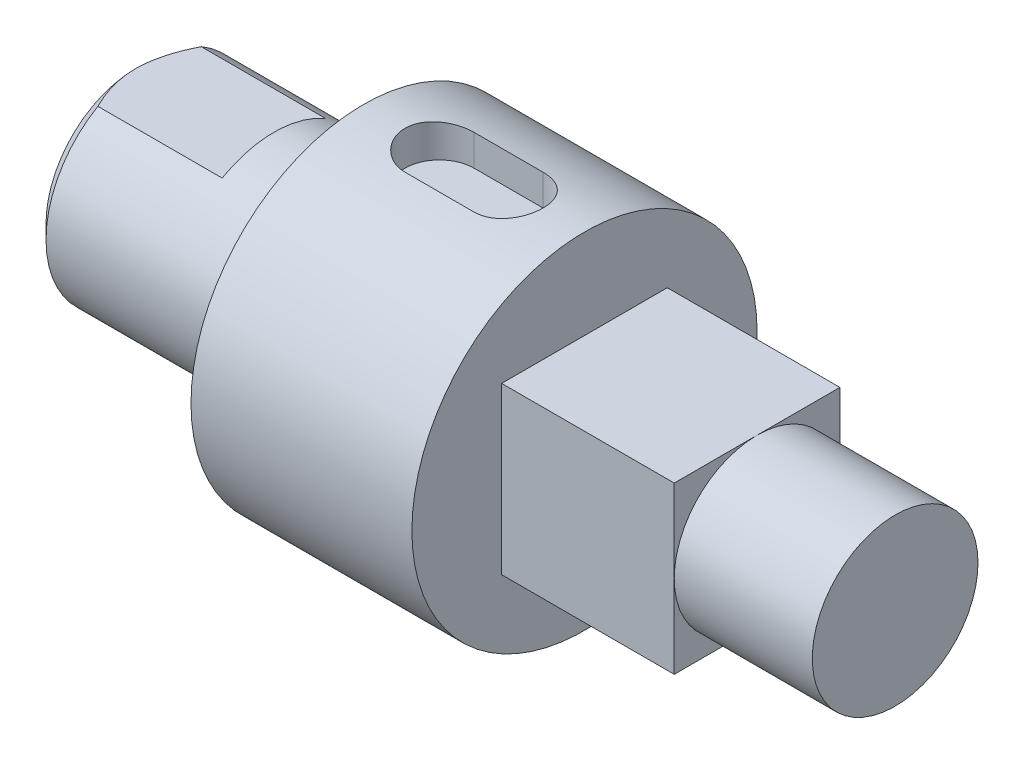
ISO-10303-21;
HEADER;
FILE_DESCRIPTION(('STEP AP214'),'2;1');
FILE_NAME('part.step','',(''),(''),'','','');
FILE_SCHEMA(('AUTOMOTIVE_DESIGN { 1 0 10303 214 1 1 1 1 }'));
ENDSEC;
DATA;
#1=APPLICATION_CONTEXT('core data for automotive mechanical design processes');
#2=APPLICATION_PROTOCOL_DEFINITION('international standard','automotive_design',2000,#1);
#3=PRODUCT_CONTEXT('',#1,'mechanical');
#4=PRODUCT('Part','Part','',(#3));
#5=PRODUCT_RELATED_PRODUCT_CATEGORY('part','',(#4));
#6=PRODUCT_DEFINITION_FORMATION('','',#4);
#7=PRODUCT_DEFINITION_CONTEXT('part definition',#1,'design');
#8=PRODUCT_DEFINITION('design','',#6,#7);
#9=PRODUCT_DEFINITION_SHAPE('','',#8);
#10=(LENGTH_UNIT() NAMED_UNIT(*) SI_UNIT(.MILLI.,.METRE.));
#11=(NAMED_UNIT(*) PLANE_ANGLE_UNIT() SI_UNIT($,.RADIAN.));
#12=(NAMED_UNIT(*) SI_UNIT($,.STERADIAN.) SOLID_ANGLE_UNIT());
#13=UNCERTAINTY_MEASURE_WITH_UNIT(LENGTH_MEASURE(1.E-05),#10,'distance_accuracy_value','');
#14=(GEOMETRIC_REPRESENTATION_CONTEXT(3) GLOBAL_UNCERTAINTY_ASSIGNED_CONTEXT((#13)) GLOBAL_UNIT_ASSIGNED_CONTEXT((#10,
#11,#12)) REPRESENTATION_CONTEXT('',''));
#15=CARTESIAN_POINT('',(0.,0.,0.));
#16=DIRECTION('',(0.,0.,1.));
#17=DIRECTION('',(1.,0.,0.));
#18=AXIS2_PLACEMENT_3D('',#15,#16,#17);
#19=CARTESIAN_POINT('',(110.,0.,0.));
#20=DIRECTION('',(-1.,0.,0.));
#21=DIRECTION('',(0.,0.,1.));
#22=AXIS2_PLACEMENT_3D('',#19,#20,#21);
#23=CYLINDRICAL_SURFACE('',#22,25.);
#24=DIRECTION('',(-1.,0.,0.));
#25=VECTOR('',#24,1.);
#26=CARTESIAN_POINT('',(110.,24.4948974278318,-5.));
#27=LINE('',#26,#25);
#28=CARTESIAN_POINT('',(44.,24.4948974278318,-5.));
#29=VERTEX_POINT('',#28);
#30=CARTESIAN_POINT('',(54.,24.4948974278318,-5.));
#31=VERTEX_POINT('',#30);
#32=EDGE_CURVE('E12',#29,#31,#27,.F.);
#33=ORIENTED_EDGE('',*,*,#32,.T.);
#34=CARTESIAN_POINT('',(54.,24.4948974278318,-5.));
#35=CARTESIAN_POINT('',(54.1391253266414,24.4948849644864,-5.00001666827265));
#36=CARTESIAN_POINT('',(54.2782463400245,24.4960823045704,-4.99419397242177));
#37=CARTESIAN_POINT('',(54.5554648435272,24.50080611049,-4.97099170943313));
#38=CARTESIAN_POINT('',(54.6935624581255,24.5043322881998,-4.95361357194363));
#39=CARTESIAN_POINT('',(54.9675458103971,24.513616269194,-4.9074573297008));
#40=CARTESIAN_POINT('',(55.1034345908507,24.5193706725256,-4.87869659169542));
#41=CARTESIAN_POINT('',(55.3722534051872,24.5329384582687,-4.81000656952587));
#42=CARTESIAN_POINT('',(55.5051834269891,24.5407518490855,-4.77007723976852));
#43=CARTESIAN_POINT('',(55.7671454567224,24.5582108316482,-4.67935997504848));
#44=CARTESIAN_POINT('',(55.8961778299596,24.5678562510663,-4.62857306133625));
#45=CARTESIAN_POINT('',(56.1495228220018,24.5887068281803,-4.5164969896502));
#46=CARTESIAN_POINT('',(56.2738336734668,24.5999125627442,-4.45520394548308));
#47=CARTESIAN_POINT('',(56.5168156612067,24.6235607101597,-4.32259070656745));
#48=CARTESIAN_POINT('',(56.6354883905463,24.6360027705757,-4.25127336702452));
#49=CARTESIAN_POINT('',(56.86648984474,24.6617838379427,-4.09907006911225));
#50=CARTESIAN_POINT('',(56.9788161769435,24.6751231790797,-4.01818053703546));
#51=CARTESIAN_POINT('',(57.1976679526694,24.7024927456793,-3.84636310105368));
#52=CARTESIAN_POINT('',(57.3041059155987,24.7165294141223,-3.75532477701367));
#53=CARTESIAN_POINT('',(57.509000564672,24.7447526144403,-3.56461921808491));
#54=CARTESIAN_POINT('',(57.6074542781927,24.7589391999292,-3.46494879767303));
#55=CARTESIAN_POINT('',(57.7956503618845,24.7870592087542,-3.25770259068246));
#56=CARTESIAN_POINT('',(57.8853945639721,24.8009926848246,-3.15012847492922));
#57=CARTESIAN_POINT('',(58.0556088733399,24.8282278973016,-2.92773828992183));
#58=CARTESIAN_POINT('',(58.1360755503133,24.8415293989775,-2.81291956614297));
#59=CARTESIAN_POINT('',(58.2877613382002,24.8672326807152,-2.57586261860518));
#60=CARTESIAN_POINT('',(58.3588975606977,24.8796260142365,-2.45357041583781));
#61=CARTESIAN_POINT('',(58.4906250198366,24.9030421535279,-2.20324717771265));
#62=CARTESIAN_POINT('',(58.5512123017208,24.9140644448591,-2.07521401261382));
#63=CARTESIAN_POINT('',(58.6613208436174,24.9344136360483,-1.81441746775922));
#64=CARTESIAN_POINT('',(58.7108475984345,24.9437413773173,-1.68165647494045));
#65=CARTESIAN_POINT('',(58.7985020176939,24.9604441197166,-1.41225203764253));
#66=CARTESIAN_POINT('',(58.8366255558689,24.9678184138796,-1.27560720732984));
#67=CARTESIAN_POINT('',(58.9007026495545,24.9803102866208,-1.00133010670781));
#68=CARTESIAN_POINT('',(58.9268137751061,24.9854570281343,-0.863736164157341));
#69=CARTESIAN_POINT('',(58.9674264931271,24.9934984482444,-0.58678427673382));
#70=CARTESIAN_POINT('',(58.9819240548557,24.9963923449322,-0.447425736450277));
#71=CARTESIAN_POINT('',(59.007722093994,25.0015345303172,-0.0282339145439908));
#72=CARTESIAN_POINT('',(59.0014024880643,25.0002582152219,0.253035346754794));
#73=CARTESIAN_POINT('',(58.9570342009315,24.9914408151569,0.668581641108651));
#74=CARTESIAN_POINT('',(58.9366814465338,24.9874010387134,0.805138662755828));
#75=CARTESIAN_POINT('',(58.8847845695753,24.9771983765685,1.07603260238649));
#76=CARTESIAN_POINT('',(58.8532443393329,24.9710362292986,1.21037027552905));
#77=CARTESIAN_POINT('',(58.7791934341752,24.9567501974578,1.47591760067314));
#78=CARTESIAN_POINT('',(58.7366787586714,24.9486255975703,1.60712609287945));
#79=CARTESIAN_POINT('',(58.6410233920703,24.9306416146559,1.8654381437386));
#80=CARTESIAN_POINT('',(58.5878863834583,24.9207828329664,1.99254310728992));
#81=CARTESIAN_POINT('',(58.4709762706757,24.899524196117,2.2426674277943));
#82=CARTESIAN_POINT('',(58.4071346269613,24.8881145061704,2.36565390182104));
#83=CARTESIAN_POINT('',(58.2695501862382,24.8641202109373,2.60577855318809));
#84=CARTESIAN_POINT('',(58.1958108496162,24.851536016742,2.72291875492852));
#85=CARTESIAN_POINT('',(58.0388948841914,24.8255248721503,2.95067106820487));
#86=CARTESIAN_POINT('',(57.9557142996826,24.8120975695679,3.06128041370929));
#87=CARTESIAN_POINT('',(57.7805378509761,24.7847732726215,3.27515412500651));
#88=CARTESIAN_POINT('',(57.6885450703313,24.7708764436475,3.37842103817659));
#89=CARTESIAN_POINT('',(57.4946284635822,24.7427376365478,3.57873527346883));
#90=CARTESIAN_POINT('',(57.3925576496266,24.7284939036525,3.67564011377472));
#91=CARTESIAN_POINT('',(57.1806275854925,24.7003111004447,3.86048859181167));
#92=CARTESIAN_POINT('',(57.0707711471919,24.6863719224938,3.94843543715));
#93=CARTESIAN_POINT('',(56.843906189763,24.6591791231742,4.11485123813351));
#94=CARTESIAN_POINT('',(56.7268930120297,24.6459259589468,4.19331391911306));
#95=CARTESIAN_POINT('',(56.4866232792523,24.6205002572597,4.34010555279844));
#96=CARTESIAN_POINT('',(56.3633691261763,24.6083273089475,4.40843836501602));
#97=CARTESIAN_POINT('',(56.111033527101,24.5853743099635,4.53469984736732));
#98=CARTESIAN_POINT('',(55.981935173049,24.5745987023543,4.59259554826928));
#99=CARTESIAN_POINT('',(55.719229383387,24.5548081643223,4.69725810665845));
#100=CARTESIAN_POINT('',(55.5856237328049,24.5457925462705,4.74402931205846));
#101=CARTESIAN_POINT('',(55.3149597529441,24.5297959324801,4.82606031456236));
#102=CARTESIAN_POINT('',(55.1779051839506,24.5228128169847,4.86133210938724));
#103=CARTESIAN_POINT('',(54.9012624710491,24.5110829912476,4.92013311165956));
#104=CARTESIAN_POINT('',(54.7616755648169,24.5063352175227,4.94366790340399));
#105=CARTESIAN_POINT('',(54.5182407981624,24.500162299976,4.97415554156174));
#106=CARTESIAN_POINT('',(54.4147417318496,24.4981897115681,4.98385170759339));
#107=CARTESIAN_POINT('',(54.2074982694361,24.4955566519276,4.99677038633664));
#108=CARTESIAN_POINT('',(54.1037545762686,24.4948939848493,5.00000373289602));
#109=CARTESIAN_POINT('',(54.,24.4948974278318,5.));
#110=B_SPLINE_CURVE_WITH_KNOTS('',3,(#34,#35,#36,#37,#38,#39,#40,#41,#42,#43,#44,#45,#46,#47,
#48,#49,#50,#51,#52,#53,#54,#55,#56,#57,#58,#59,#60,#61,#62,#63,#64,#65,#66,#67,#68,#69,#70,#71,
#72,#73,#74,#75,#76,#77,#78,#79,#80,#81,#82,#83,#84,#85,#86,#87,#88,#89,#90,#91,#92,#93,#94,#95,
#96,#97,#98,#99,#100,#101,#102,#103,#104,#105,#106,#107,#108,#109),.UNSPECIFIED.,.F.,.F.,(4,2,2,
2,2,2,2,2,2,2,2,2,2,2,2,2,2,2,2,2,2,2,2,2,2,2,2,2,2,2,2,2,2,2,2,2,2,4),(0.,0.417242551789606,
0.834433491607678,1.25099035047395,1.6675489098622,2.08406830550986,2.50074210451561,
2.91729746251716,3.33400883196916,3.7558036459226,4.17775478454161,4.59961697876816,
5.02163465704723,5.44717860948246,5.87288175479562,6.29837294048707,6.72401790492142,
7.14390813062632,7.56394402533167,8.40304192223056,8.81705081972049,9.2309158173335,
9.64493189752779,10.0588046972974,10.4754363941303,10.8919228076445,11.3085843698369,
11.7251006632377,12.1489910901879,12.5727291962766,12.9967461280637,13.4206010905545,
13.8457723408149,14.2707771424992,14.6953370927157,15.1196948502477,15.4314077968161,
15.7425977684821),.UNSPECIFIED.);
#111=CARTESIAN_POINT('',(54.,24.4948974278318,5.));
#112=VERTEX_POINT('',#111);
#113=EDGE_CURVE('E311',#31,#112,#110,.T.);
#114=ORIENTED_EDGE('',*,*,#113,.T.);
#115=DIRECTION('',(-1.,0.,0.));
#116=VECTOR('',#115,1.);
#117=CARTESIAN_POINT('',(110.,24.4948974278318,5.));
#118=LINE('',#117,#116);
#119=CARTESIAN_POINT('',(44.,24.4948974278318,5.));
#120=VERTEX_POINT('',#119);
#121=EDGE_CURVE('E59',#112,#120,#118,.T.);
#122=ORIENTED_EDGE('',*,*,#121,.T.);
#123=CARTESIAN_POINT('',(44.,24.4948974278318,5.));
#124=CARTESIAN_POINT('',(43.8608746733586,24.4948849644864,5.00001666827265));
#125=CARTESIAN_POINT('',(43.7217536599755,24.4960823045704,4.99419397242177));
#126=CARTESIAN_POINT('',(43.4445351564728,24.50080611049,4.97099170943313));
#127=CARTESIAN_POINT('',(43.3064375418745,24.5043322881998,4.95361357194363));
#128=CARTESIAN_POINT('',(43.0324541896029,24.513616269194,4.9074573297008));
#129=CARTESIAN_POINT('',(42.8965654091493,24.5193706725256,4.87869659169542));
#130=CARTESIAN_POINT('',(42.6277465948128,24.5329384582687,4.81000656952587));
#131=CARTESIAN_POINT('',(42.4948165730108,24.5407518490855,4.77007723976852));
#132=CARTESIAN_POINT('',(42.2328545432776,24.5582108316482,4.67935997504848));
#133=CARTESIAN_POINT('',(42.1038221700404,24.5678562510663,4.62857306133625));
#134=CARTESIAN_POINT('',(41.8504771779982,24.5887068281803,4.5164969896502));
#135=CARTESIAN_POINT('',(41.7261663265332,24.5999125627442,4.45520394548308));
#136=CARTESIAN_POINT('',(41.4831843387933,24.6235607101597,4.32259070656745));
#137=CARTESIAN_POINT('',(41.3645116094537,24.6360027705757,4.25127336702452));
#138=CARTESIAN_POINT('',(41.13351015526,24.6617838379427,4.09907006911225));
#139=CARTESIAN_POINT('',(41.0211838230565,24.6751231790797,4.01818053703546));
#140=CARTESIAN_POINT('',(40.8023320473306,24.7024927456793,3.84636310105368));
#141=CARTESIAN_POINT('',(40.6958940844013,24.7165294141223,3.75532477701367));
#142=CARTESIAN_POINT('',(40.4909994353279,24.7447526144403,3.56461921808491));
#143=CARTESIAN_POINT('',(40.3925457218073,24.7589391999292,3.46494879767303));
#144=CARTESIAN_POINT('',(40.2043496381155,24.7870592087542,3.25770259068246));
#145=CARTESIAN_POINT('',(40.1146054360279,24.8009926848246,3.15012847492922));
#146=CARTESIAN_POINT('',(39.9443911266601,24.8282278973016,2.92773828992183));
#147=CARTESIAN_POINT('',(39.8639244496867,24.8415293989775,2.81291956614297));
#148=CARTESIAN_POINT('',(39.7122386617998,24.8672326807152,2.57586261860519));
#149=CARTESIAN_POINT('',(39.6411024393023,24.8796260142365,2.45357041583781));
#150=CARTESIAN_POINT('',(39.5093749801634,24.9030421535279,2.20324717771265));
#151=CARTESIAN_POINT('',(39.4487876982792,24.9140644448591,2.07521401261382));
#152=CARTESIAN_POINT('',(39.3386791563826,24.9344136360483,1.81441746775923));
#153=CARTESIAN_POINT('',(39.2891524015655,24.9437413773173,1.68165647494045));
#154=CARTESIAN_POINT('',(39.2014979823061,24.9604441197166,1.41225203764253));
#155=CARTESIAN_POINT('',(39.1633744441311,24.9678184138796,1.27560720732984));
#156=CARTESIAN_POINT('',(39.0992973504455,24.9803102866208,1.00133010670781));
#157=CARTESIAN_POINT('',(39.0731862248938,24.9854570281343,0.86373616415734));
#158=CARTESIAN_POINT('',(39.0325735068729,24.9934984482444,0.586784276733819));
#159=CARTESIAN_POINT('',(39.0180759451443,24.9963923449322,0.447425736450276));
#160=CARTESIAN_POINT('',(38.992277906006,25.0015345303172,0.0282339145439898));
#161=CARTESIAN_POINT('',(38.9985975119357,25.0002582152219,-0.253035346754795));
#162=CARTESIAN_POINT('',(39.0429657990684,24.9914408151569,-0.668581641108652));
#163=CARTESIAN_POINT('',(39.0633185534661,24.9874010387134,-0.805138662755828));
#164=CARTESIAN_POINT('',(39.1152154304247,24.9771983765685,-1.07603260238649));
#165=CARTESIAN_POINT('',(39.1467556606671,24.9710362292986,-1.21037027552905));
#166=CARTESIAN_POINT('',(39.2208065658248,24.9567501974578,-1.47591760067314));
#167=CARTESIAN_POINT('',(39.2633212413286,24.9486255975703,-1.60712609287945));
#168=CARTESIAN_POINT('',(39.3589766079297,24.9306416146559,-1.8654381437386));
#169=CARTESIAN_POINT('',(39.4121136165417,24.9207828329664,-1.99254310728992));
#170=CARTESIAN_POINT('',(39.5290237293243,24.899524196117,-2.2426674277943));
#171=CARTESIAN_POINT('',(39.5928653730387,24.8881145061704,-2.36565390182104));
#172=CARTESIAN_POINT('',(39.7304498137618,24.8641202109373,-2.60577855318809));
#173=CARTESIAN_POINT('',(39.8041891503838,24.851536016742,-2.72291875492852));
#174=CARTESIAN_POINT('',(39.9611051158086,24.8255248721503,-2.95067106820487));
#175=CARTESIAN_POINT('',(40.0442857003174,24.8120975695679,-3.06128041370929));
#176=CARTESIAN_POINT('',(40.2194621490238,24.7847732726215,-3.27515412500651));
#177=CARTESIAN_POINT('',(40.3114549296687,24.7708764436475,-3.37842103817659));
#178=CARTESIAN_POINT('',(40.5053715364178,24.7427376365478,-3.57873527346883));
#179=CARTESIAN_POINT('',(40.6074423503734,24.7284939036525,-3.67564011377471));
#180=CARTESIAN_POINT('',(40.8193724145075,24.7003111004447,-3.86048859181167));
#181=CARTESIAN_POINT('',(40.9292288528081,24.6863719224938,-3.94843543714999));
#182=CARTESIAN_POINT('',(41.156093810237,24.6591791231742,-4.1148512381335));
#183=CARTESIAN_POINT('',(41.2731069879703,24.6459259589468,-4.19331391911305));
#184=CARTESIAN_POINT('',(41.5133767207476,24.6205002572597,-4.34010555279843));
#185=CARTESIAN_POINT('',(41.6366308738237,24.6083273089475,-4.40843836501602));
#186=CARTESIAN_POINT('',(41.888966472899,24.5853743099635,-4.53469984736732));
#187=CARTESIAN_POINT('',(42.018064826951,24.5745987023543,-4.59259554826928));
#188=CARTESIAN_POINT('',(42.280770616613,24.5548081643223,-4.69725810665845));
#189=CARTESIAN_POINT('',(42.4143762671951,24.5457925462705,-4.74402931205847));
#190=CARTESIAN_POINT('',(42.6850402470559,24.5297959324801,-4.82606031456236));
#191=CARTESIAN_POINT('',(42.8220948160494,24.5228128169847,-4.86133210938725));
#192=CARTESIAN_POINT('',(43.0987375289509,24.5110829912476,-4.92013311165956));
#193=CARTESIAN_POINT('',(43.2383244351831,24.5063352175227,-4.94366790340399));
#194=CARTESIAN_POINT('',(43.4817592018375,24.500162299976,-4.97415554156174));
#195=CARTESIAN_POINT('',(43.5852582681504,24.4981897115681,-4.98385170759339));
#196=CARTESIAN_POINT('',(43.7925017305639,24.4955566519276,-4.99677038633664));
#197=CARTESIAN_POINT('',(43.8962454237314,24.4948939848493,-5.00000373289602));
#198=CARTESIAN_POINT('',(44.,24.4948974278318,-5.));
#199=B_SPLINE_CURVE_WITH_KNOTS('',3,(#123,#124,#125,#126,#127,#128,#129,#130,#131,#132,#133,
#134,#135,#136,#137,#138,#139,#140,#141,#142,#143,#144,#145,#146,#147,#148,#149,#150,#151,#152,
#153,#154,#155,#156,#157,#158,#159,#160,#161,#162,#163,#164,#165,#166,#167,#168,#169,#170,#171,
#172,#173,#174,#175,#176,#177,#178,#179,#180,#181,#182,#183,#184,#185,#186,#187,#188,#189,#190,
#191,#192,#193,#194,#195,#196,#197,#198),.UNSPECIFIED.,.F.,.F.,(4,2,2,2,2,2,2,2,2,2,2,2,2,2,2,2,
2,2,2,2,2,2,2,2,2,2,2,2,2,2,2,2,2,2,2,2,2,4),(0.,0.417242551789613,0.834433491607678,
1.25099035047397,1.66754890986221,2.08406830550987,2.50074210451562,2.91729746251717,
3.33400883196917,3.75580364592261,4.17775478454161,4.59961697876817,5.02163465704724,
5.44717860948247,5.87288175479563,6.29837294048707,6.72401790492143,7.14390813062633,
7.56394402533168,8.40304192223056,8.81705081972049,9.2309158173335,9.6449318975278,
10.0588046972975,10.4754363941303,10.8919228076445,11.3085843698369,11.7251006632377,
12.1489910901879,12.5727291962766,12.9967461280637,13.4206010905545,13.8457723408149,
14.2707771424992,14.6953370927157,15.1196948502477,15.4314077968161,15.7425977684821),.UNSPECIFIED.);
#200=EDGE_CURVE('E61',#120,#29,#199,.T.);
#201=ORIENTED_EDGE('',*,*,#200,.T.);
#202=EDGE_LOOP('',(#33,#114,#122,#201));
#203=FACE_BOUND('',#202,.T.);
#204=CARTESIAN_POINT('',(65.,0.,0.));
#205=DIRECTION('',(1.,0.,0.));
#206=DIRECTION('',(0.,0.,-1.));
#207=AXIS2_PLACEMENT_3D('',#204,#205,#206);
#208=CIRCLE('',#207,25.);
#209=CARTESIAN_POINT('',(65.,0.,-25.));
#210=VERTEX_POINT('',#209);
#211=EDGE_CURVE('E222',#210,#210,#208,.T.);
#212=ORIENTED_EDGE('',*,*,#211,.F.);
#213=EDGE_LOOP('',(#212));
#214=FACE_BOUND('',#213,.T.);
#215=CARTESIAN_POINT('',(33.,0.,0.));
#216=DIRECTION('',(-1.,0.,0.));
#217=DIRECTION('',(0.,0.,1.));
#218=AXIS2_PLACEMENT_3D('',#215,#216,#217);
#219=CIRCLE('',#218,25.);
#220=CARTESIAN_POINT('',(33.,0.,25.));
#221=VERTEX_POINT('',#220);
#222=EDGE_CURVE('E184',#221,#221,#219,.T.);
#223=ORIENTED_EDGE('',*,*,#222,.F.);
#224=EDGE_LOOP('',(#223));
#225=FACE_BOUND('',#224,.T.);
#226=ADVANCED_FACE('F48',(#203,#214,#225),#23,.T.);
#227=CARTESIAN_POINT('',(65.,-12.,-12.));
#228=DIRECTION('',(0.,0.,-1.));
#229=DIRECTION('',(0.,1.,0.));
#230=AXIS2_PLACEMENT_3D('',#227,#228,#229);
#231=PLANE('',#230);
#232=DIRECTION('',(1.,0.,0.));
#233=VECTOR('',#232,1.);
#234=CARTESIAN_POINT('',(65.,12.,-12.));
#235=LINE('',#234,#233);
#236=CARTESIAN_POINT('',(65.,12.,-12.));
#237=VERTEX_POINT('',#236);
#238=CARTESIAN_POINT('',(90.,12.,-12.));
#239=VERTEX_POINT('',#238);
#240=EDGE_CURVE('E220',#237,#239,#235,.T.);
#241=ORIENTED_EDGE('',*,*,#240,.T.);
#242=DIRECTION('',(0.,-1.,0.));
#243=VECTOR('',#242,1.);
#244=CARTESIAN_POINT('',(90.,-12.,-12.));
#245=LINE('',#244,#243);
#246=CARTESIAN_POINT('',(90.,0.,-12.));
#247=VERTEX_POINT('',#246);
#248=EDGE_CURVE('E204',#239,#247,#245,.T.);
#249=ORIENTED_EDGE('',*,*,#248,.T.);
#250=CARTESIAN_POINT('',(90.,-12.,-12.));
#251=VERTEX_POINT('',#250);
#252=EDGE_CURVE('E203',#247,#251,#245,.T.);
#253=ORIENTED_EDGE('',*,*,#252,.T.);
#254=DIRECTION('',(1.,0.,0.));
#255=VECTOR('',#254,1.);
#256=CARTESIAN_POINT('',(65.,-12.,-12.));
#257=LINE('',#256,#255);
#258=CARTESIAN_POINT('',(65.,-12.,-12.));
#259=VERTEX_POINT('',#258);
#260=EDGE_CURVE('E217',#259,#251,#257,.T.);
#261=ORIENTED_EDGE('',*,*,#260,.F.);
#262=DIRECTION('',(0.,1.,0.));
#263=VECTOR('',#262,1.);
#264=CARTESIAN_POINT('',(65.,-12.,-12.));
#265=LINE('',#264,#263);
#266=EDGE_CURVE('E202',#259,#237,#265,.T.);
#267=ORIENTED_EDGE('',*,*,#266,.T.);
#268=EDGE_LOOP('',(#241,#249,#253,#261,#267));
#269=FACE_BOUND('',#268,.T.);
#270=ADVANCED_FACE('F289',(#269),#231,.T.);
#271=CARTESIAN_POINT('',(65.,-12.,12.));
#272=DIRECTION('',(0.,-1.,0.));
#273=DIRECTION('',(0.,0.,-1.));
#274=AXIS2_PLACEMENT_3D('',#271,#272,#273);
#275=PLANE('',#274);
#276=ORIENTED_EDGE('',*,*,#260,.T.);
#277=DIRECTION('',(0.,0.,1.));
#278=VECTOR('',#277,1.);
#279=CARTESIAN_POINT('',(90.,-12.,12.));
#280=LINE('',#279,#278);
#281=CARTESIAN_POINT('',(90.,-12.,0.));
#282=VERTEX_POINT('',#281);
#283=EDGE_CURVE('E199',#251,#282,#280,.T.);
#284=ORIENTED_EDGE('',*,*,#283,.T.);
#285=CARTESIAN_POINT('',(90.,-12.,12.));
#286=VERTEX_POINT('',#285);
#287=EDGE_CURVE('E197',#282,#286,#280,.T.);
#288=ORIENTED_EDGE('',*,*,#287,.T.);
#289=DIRECTION('',(1.,0.,0.));
#290=VECTOR('',#289,1.);
#291=CARTESIAN_POINT('',(65.,-12.,12.));
#292=LINE('',#291,#290);
#293=CARTESIAN_POINT('',(65.,-12.,12.));
#294=VERTEX_POINT('',#293);
#295=EDGE_CURVE('E225',#294,#286,#292,.T.);
#296=ORIENTED_EDGE('',*,*,#295,.F.);
#297=DIRECTION('',(0.,0.,-1.));
#298=VECTOR('',#297,1.);
#299=CARTESIAN_POINT('',(65.,-12.,12.));
#300=LINE('',#299,#298);
#301=EDGE_CURVE('E212',#294,#259,#300,.T.);
#302=ORIENTED_EDGE('',*,*,#301,.T.);
#303=EDGE_LOOP('',(#276,#284,#288,#296,#302));
#304=FACE_BOUND('',#303,.T.);
#305=ADVANCED_FACE('F285',(#304),#275,.T.);
#306=CARTESIAN_POINT('',(65.,12.,12.));
#307=DIRECTION('',(0.,0.,1.));
#308=DIRECTION('',(0.,-1.,0.));
#309=AXIS2_PLACEMENT_3D('',#306,#307,#308);
#310=PLANE('',#309);
#311=ORIENTED_EDGE('',*,*,#295,.T.);
#312=DIRECTION('',(0.,1.,0.));
#313=VECTOR('',#312,1.);
#314=CARTESIAN_POINT('',(90.,12.,12.));
#315=LINE('',#314,#313);
#316=CARTESIAN_POINT('',(90.,0.,12.));
#317=VERTEX_POINT('',#316);
#318=EDGE_CURVE('E198',#286,#317,#315,.T.);
#319=ORIENTED_EDGE('',*,*,#318,.T.);
#320=CARTESIAN_POINT('',(90.,12.,12.));
#321=VERTEX_POINT('',#320);
#322=EDGE_CURVE('E187',#317,#321,#315,.T.);
#323=ORIENTED_EDGE('',*,*,#322,.T.);
#324=DIRECTION('',(1.,0.,0.));
#325=VECTOR('',#324,1.);
#326=CARTESIAN_POINT('',(65.,12.,12.));
#327=LINE('',#326,#325);
#328=CARTESIAN_POINT('',(65.,12.,12.));
#329=VERTEX_POINT('',#328);
#330=EDGE_CURVE('E223',#329,#321,#327,.T.);
#331=ORIENTED_EDGE('',*,*,#330,.F.);
#332=DIRECTION('',(0.,-1.,0.));
#333=VECTOR('',#332,1.);
#334=CARTESIAN_POINT('',(65.,12.,12.));
#335=LINE('',#334,#333);
#336=EDGE_CURVE('E211',#329,#294,#335,.T.);
#337=ORIENTED_EDGE('',*,*,#336,.T.);
#338=EDGE_LOOP('',(#311,#319,#323,#331,#337));
#339=FACE_BOUND('',#338,.T.);
#340=ADVANCED_FACE('F290',(#339),#310,.T.);
#341=CARTESIAN_POINT('',(65.,12.,-12.));
#342=DIRECTION('',(0.,1.,0.));
#343=DIRECTION('',(0.,0.,1.));
#344=AXIS2_PLACEMENT_3D('',#341,#342,#343);
#345=PLANE('',#344);
#346=ORIENTED_EDGE('',*,*,#330,.T.);
#347=DIRECTION('',(0.,0.,-1.));
#348=VECTOR('',#347,1.);
#349=CARTESIAN_POINT('',(90.,12.,-12.));
#350=LINE('',#349,#348);
#351=CARTESIAN_POINT('',(90.,12.,0.));
#352=VERTEX_POINT('',#351);
#353=EDGE_CURVE('E233',#321,#352,#350,.T.);
#354=ORIENTED_EDGE('',*,*,#353,.T.);
#355=EDGE_CURVE('E235',#352,#239,#350,.T.);
#356=ORIENTED_EDGE('',*,*,#355,.T.);
#357=ORIENTED_EDGE('',*,*,#240,.F.);
#358=DIRECTION('',(0.,0.,1.));
#359=VECTOR('',#358,1.);
#360=CARTESIAN_POINT('',(65.,12.,-12.));
#361=LINE('',#360,#359);
#362=EDGE_CURVE('E208',#237,#329,#361,.T.);
#363=ORIENTED_EDGE('',*,*,#362,.T.);
#364=EDGE_LOOP('',(#346,#354,#356,#357,#363));
#365=FACE_BOUND('',#364,.T.);
#366=ADVANCED_FACE('F295',(#365),#345,.T.);
#367=CARTESIAN_POINT('',(65.,0.,0.));
#368=DIRECTION('',(1.,0.,0.));
#369=DIRECTION('',(0.,0.,-1.));
#370=AXIS2_PLACEMENT_3D('',#367,#368,#369);
#371=PLANE('',#370);
#372=ORIENTED_EDGE('',*,*,#301,.F.);
#373=ORIENTED_EDGE('',*,*,#336,.F.);
#374=ORIENTED_EDGE('',*,*,#362,.F.);
#375=ORIENTED_EDGE('',*,*,#266,.F.);
#376=EDGE_LOOP('',(#372,#373,#374,#375));
#377=FACE_BOUND('',#376,.T.);
#378=ORIENTED_EDGE('',*,*,#211,.T.);
#379=EDGE_LOOP('',(#378));
#380=FACE_BOUND('',#379,.T.);
#381=ADVANCED_FACE('F298',(#377,#380),#371,.T.);
#382=CARTESIAN_POINT('',(90.,0.,0.));
#383=DIRECTION('',(1.,0.,0.));
#384=DIRECTION('',(0.,0.,-1.));
#385=AXIS2_PLACEMENT_3D('',#382,#383,#384);
#386=PLANE('',#385);
#387=ORIENTED_EDGE('',*,*,#355,.F.);
#388=CARTESIAN_POINT('',(90.,0.,0.));
#389=DIRECTION('',(1.,0.,0.));
#390=DIRECTION('',(0.,0.,-1.));
#391=AXIS2_PLACEMENT_3D('',#388,#389,#390);
#392=CIRCLE('',#391,12.);
#393=EDGE_CURVE('E183',#247,#352,#392,.T.);
#394=ORIENTED_EDGE('',*,*,#393,.F.);
#395=ORIENTED_EDGE('',*,*,#248,.F.);
#396=EDGE_LOOP('',(#387,#394,#395));
#397=FACE_BOUND('',#396,.T.);
#398=ADVANCED_FACE('F282',(#397),#386,.T.);
#399=EDGE_CURVE('E186',#282,#247,#392,.T.);
#400=ORIENTED_EDGE('',*,*,#399,.F.);
#401=ORIENTED_EDGE('',*,*,#283,.F.);
#402=ORIENTED_EDGE('',*,*,#252,.F.);
#403=EDGE_LOOP('',(#400,#401,#402));
#404=FACE_BOUND('',#403,.T.);
#405=ADVANCED_FACE('F427',(#404),#386,.T.);
#406=EDGE_CURVE('E492',#317,#282,#392,.T.);
#407=ORIENTED_EDGE('',*,*,#406,.F.);
#408=ORIENTED_EDGE('',*,*,#318,.F.);
#409=ORIENTED_EDGE('',*,*,#287,.F.);
#410=EDGE_LOOP('',(#407,#408,#409));
#411=FACE_BOUND('',#410,.T.);
#412=ADVANCED_FACE('F279',(#411),#386,.T.);
#413=CARTESIAN_POINT('',(90.,0.,0.));
#414=DIRECTION('',(1.,0.,0.));
#415=DIRECTION('',(0.,0.,-1.));
#416=AXIS2_PLACEMENT_3D('',#413,#414,#415);
#417=CYLINDRICAL_SURFACE('',#416,12.);
#418=CARTESIAN_POINT('',(110.,0.,0.));
#419=DIRECTION('',(1.,0.,0.));
#420=DIRECTION('',(0.,0.,-1.));
#421=AXIS2_PLACEMENT_3D('',#418,#419,#420);
#422=CIRCLE('',#421,12.);
#423=CARTESIAN_POINT('',(110.,0.,-12.));
#424=VERTEX_POINT('',#423);
#425=EDGE_CURVE('E192',#424,#424,#422,.T.);
#426=ORIENTED_EDGE('',*,*,#425,.F.);
#427=EDGE_LOOP('',(#426));
#428=FACE_BOUND('',#427,.T.);
#429=ORIENTED_EDGE('',*,*,#399,.T.);
#430=ORIENTED_EDGE('',*,*,#393,.T.);
#431=EDGE_CURVE('E190',#352,#317,#392,.T.);
#432=ORIENTED_EDGE('',*,*,#431,.T.);
#433=ORIENTED_EDGE('',*,*,#406,.T.);
#434=EDGE_LOOP('',(#429,#430,#432,#433));
#435=FACE_BOUND('',#434,.T.);
#436=ADVANCED_FACE('F273',(#428,#435),#417,.T.);
#437=ORIENTED_EDGE('',*,*,#431,.F.);
#438=ORIENTED_EDGE('',*,*,#353,.F.);
#439=ORIENTED_EDGE('',*,*,#322,.F.);
#440=EDGE_LOOP('',(#437,#438,#439));
#441=FACE_BOUND('',#440,.T.);
#442=ADVANCED_FACE('F280',(#441),#386,.T.);
#443=CARTESIAN_POINT('',(110.,0.,0.));
#444=DIRECTION('',(1.,0.,0.));
#445=DIRECTION('',(0.,0.,-1.));
#446=AXIS2_PLACEMENT_3D('',#443,#444,#445);
#447=PLANE('',#446);
#448=ORIENTED_EDGE('',*,*,#425,.T.);
#449=EDGE_LOOP('',(#448));
#450=FACE_BOUND('',#449,.T.);
#451=ADVANCED_FACE('F275',(#450),#447,.T.);
#452=CARTESIAN_POINT('',(33.,0.,0.));
#453=DIRECTION('',(-1.,0.,0.));
#454=DIRECTION('',(0.,0.,1.));
#455=AXIS2_PLACEMENT_3D('',#452,#453,#454);
#456=PLANE('',#455);
#457=CARTESIAN_POINT('',(33.,0.,0.));
#458=DIRECTION('',(-1.,0.,0.));
#459=DIRECTION('',(0.,0.,1.));
#460=AXIS2_PLACEMENT_3D('',#457,#458,#459);
#461=CIRCLE('',#460,15.);
#462=CARTESIAN_POINT('',(33.,0.,15.));
#463=VERTEX_POINT('',#462);
#464=EDGE_CURVE('E182',#463,#463,#461,.T.);
#465=ORIENTED_EDGE('',*,*,#464,.F.);
#466=EDGE_LOOP('',(#465));
#467=FACE_BOUND('',#466,.T.);
#468=ORIENTED_EDGE('',*,*,#222,.T.);
#469=EDGE_LOOP('',(#468));
#470=FACE_BOUND('',#469,.T.);
#471=ADVANCED_FACE('F268',(#467,#470),#456,.T.);
#472=CARTESIAN_POINT('',(33.,0.,0.));
#473=DIRECTION('',(-1.,0.,0.));
#474=DIRECTION('',(0.,0.,1.));
#475=AXIS2_PLACEMENT_3D('',#472,#473,#474);
#476=CYLINDRICAL_SURFACE('',#475,15.);
#477=CARTESIAN_POINT('',(20.,0.,0.));
#478=DIRECTION('',(1.,0.,0.));
#479=DIRECTION('',(0.,0.,-1.));
#480=AXIS2_PLACEMENT_3D('',#477,#478,#479);
#481=CIRCLE('',#480,15.);
#482=CARTESIAN_POINT('',(20.,13.,7.48331477354788));
#483=VERTEX_POINT('',#482);
#484=CARTESIAN_POINT('',(20.,13.,-7.48331477354788));
#485=VERTEX_POINT('',#484);
#486=EDGE_CURVE('E253',#483,#485,#481,.F.);
#487=ORIENTED_EDGE('',*,*,#486,.F.);
#488=DIRECTION('',(-1.,0.,0.));
#489=VECTOR('',#488,1.);
#490=CARTESIAN_POINT('',(33.,13.,7.48331477354788));
#491=LINE('',#490,#489);
#492=CARTESIAN_POINT('',(2.00000000000001,13.,7.48331477354788));
#493=VERTEX_POINT('',#492);
#494=EDGE_CURVE('E179',#493,#483,#491,.F.);
#495=ORIENTED_EDGE('',*,*,#494,.F.);
#496=CARTESIAN_POINT('',(2.00000000000001,0.,0.));
#497=DIRECTION('',(1.,0.,0.));
#498=DIRECTION('',(0.,0.,-1.));
#499=AXIS2_PLACEMENT_3D('',#496,#497,#498);
#500=CIRCLE('',#499,15.);
#501=CARTESIAN_POINT('',(2.00000000000001,13.,-7.48331477354788));
#502=VERTEX_POINT('',#501);
#503=EDGE_CURVE('E243',#493,#502,#500,.T.);
#504=ORIENTED_EDGE('',*,*,#503,.T.);
#505=DIRECTION('',(-1.,0.,0.));
#506=VECTOR('',#505,1.);
#507=CARTESIAN_POINT('',(33.,13.,-7.48331477354788));
#508=LINE('',#507,#506);
#509=EDGE_CURVE('E177',#485,#502,#508,.T.);
#510=ORIENTED_EDGE('',*,*,#509,.F.);
#511=EDGE_LOOP('',(#487,#495,#504,#510));
#512=FACE_BOUND('',#511,.T.);
#513=ORIENTED_EDGE('',*,*,#464,.T.);
#514=EDGE_LOOP('',(#513));
#515=FACE_BOUND('',#514,.T.);
#516=ADVANCED_FACE('F262',(#512,#515),#476,.T.);
#517=CARTESIAN_POINT('',(0.,0.,0.));
#518=DIRECTION('',(1.,0.,0.));
#519=DIRECTION('',(0.,0.,-1.));
#520=AXIS2_PLACEMENT_3D('',#517,#518,#519);
#521=PLANE('',#520);
#522=CARTESIAN_POINT('',(0.,0.,0.));
#523=DIRECTION('',(1.,0.,0.));
#524=DIRECTION('',(0.,0.,-1.));
#525=AXIS2_PLACEMENT_3D('',#522,#523,#524);
#526=CIRCLE('',#525,13.);
#527=CARTESIAN_POINT('',(0.,13.,0.));
#528=VERTEX_POINT('',#527);
#529=EDGE_CURVE('E236',#528,#528,#526,.F.);
#530=ORIENTED_EDGE('',*,*,#529,.T.);
#531=EDGE_LOOP('',(#530));
#532=FACE_BOUND('',#531,.T.);
#533=ADVANCED_FACE('F270',(#532),#521,.F.);
#534=CARTESIAN_POINT('',(0.,0.,0.));
#535=DIRECTION('',(1.,0.,0.));
#536=DIRECTION('',(0.,0.,-1.));
#537=AXIS2_PLACEMENT_3D('',#534,#535,#536);
#538=CONICAL_SURFACE('',#537,13.,0.785398163397443);
#539=CARTESIAN_POINT('',(14.40441383777,13.,-24.1247154965971));
#540=CARTESIAN_POINT('',(14.0933139401596,13.,-23.7713090779582));
#541=CARTESIAN_POINT('',(13.7830668092702,13.,-23.4171494384658));
#542=CARTESIAN_POINT('',(13.1645295655851,13.,-22.707117080164));
#543=CARTESIAN_POINT('',(12.8562394799298,13.,-22.3512443377171));
#544=CARTESIAN_POINT('',(12.2417477120314,13.,-21.637439378028));
#545=CARTESIAN_POINT('',(11.9355469590627,13.,-21.2795063602609));
#546=CARTESIAN_POINT('',(11.3256820521772,13.,-20.5614865019805));
#547=CARTESIAN_POINT('',(11.0220178904318,13.,-20.2013996681205));
#548=CARTESIAN_POINT('',(10.4123883488674,13.,-19.4725578753014));
#549=CARTESIAN_POINT('',(10.1064736064203,13.,-19.1037605277287));
#550=CARTESIAN_POINT('',(9.49813622271111,13.,-18.3632975055294));
#551=CARTESIAN_POINT('',(9.19571356304261,13.,-17.9916318460386));
#552=CARTESIAN_POINT('',(8.59500887653196,13.,-17.2451014273178));
#553=CARTESIAN_POINT('',(8.29672594677152,13.,-16.8702373954317));
#554=CARTESIAN_POINT('',(7.70495085083634,13.,-16.1167426696032));
#555=CARTESIAN_POINT('',(7.41145867546828,13.,-15.7381119828912));
#556=CARTESIAN_POINT('',(6.83625739601469,13.,-14.9844965523031));
#557=CARTESIAN_POINT('',(6.55443026913918,13.,-14.6096020301706));
#558=CARTESIAN_POINT('',(5.99727112569952,13.,-13.8550019621199));
#559=CARTESIAN_POINT('',(5.72193917163662,13.,-13.4752963699602));
#560=CARTESIAN_POINT('',(5.17889249301209,13.,-12.7100311570058));
#561=CARTESIAN_POINT('',(4.91118368280532,13.,-12.324467328654));
#562=CARTESIAN_POINT('',(4.38529596216571,13.,-11.5468852792059));
#563=CARTESIAN_POINT('',(4.12711685356023,13.,-11.1548671925729));
#564=CARTESIAN_POINT('',(3.62371203833903,13.,-10.3653199105933));
#565=CARTESIAN_POINT('',(3.37842811585557,13.,-9.96782798339631));
#566=CARTESIAN_POINT('',(2.90216569758849,13.,-9.16425859810924));
#567=CARTESIAN_POINT('',(2.6711888114463,13.,-8.75818018084817));
#568=CARTESIAN_POINT('',(2.22741031532528,13.,-7.93683189361179));
#569=CARTESIAN_POINT('',(2.01458535731439,13.,-7.52157472326186));
#570=CARTESIAN_POINT('',(1.61134692635828,13.,-6.68039217275916));
#571=CARTESIAN_POINT('',(1.42092566484526,13.,-6.25447056288675));
#572=CARTESIAN_POINT('',(1.07912420761037,13.,-5.41829561176149));
#573=CARTESIAN_POINT('',(0.92604039186852,13.,-5.00874518509843));
#574=CARTESIAN_POINT('',(0.649765766305897,13.,-4.17956724445228));
#575=CARTESIAN_POINT('',(0.526573800800848,13.,-3.7599401207459));
#576=CARTESIAN_POINT('',(0.316351118047704,13.,-2.91408607075072));
#577=CARTESIAN_POINT('',(0.229121345783998,13.,-2.48790939785722));
#578=CARTESIAN_POINT('',(0.0948364434055016,13.,-1.62921991139406));
#579=CARTESIAN_POINT('',(0.0477755344610015,13.,-1.19670801834033));
#580=CARTESIAN_POINT('',(-0.00328474343475517,13.,-0.324973679684381));
#581=CARTESIAN_POINT('',(-0.00687127853085167,13.,0.114273498989786));
#582=CARTESIAN_POINT('',(0.0303477923878285,13.,0.990864446389531));
#583=CARTESIAN_POINT('',(0.0711556733138346,13.,1.42820811642022));
#584=CARTESIAN_POINT('',(0.194621939637131,13.,2.29886569211103));
#585=CARTESIAN_POINT('',(0.27747014712792,13.,2.73215216050082));
#586=CARTESIAN_POINT('',(0.480120742062252,13.,3.58992584309456));
#587=CARTESIAN_POINT('',(0.599929257641726,13.,4.01441158564536));
#588=CARTESIAN_POINT('',(0.861213338728685,13.,4.82386336390808));
#589=CARTESIAN_POINT('',(1.00058894148632,13.,5.20951775956066));
#590=CARTESIAN_POINT('',(1.30180851306248,13.,5.97197148380401));
#591=CARTESIAN_POINT('',(1.46365746948359,13.,6.34876882494708));
#592=CARTESIAN_POINT('',(1.80607254607454,13.,7.09433704636006));
#593=CARTESIAN_POINT('',(1.98666475105081,13.,7.46309585255511));
#594=CARTESIAN_POINT('',(2.3630257887849,13.,8.19269272133421));
#595=CARTESIAN_POINT('',(2.55879313810628,13.,8.55353155371639));
#596=CARTESIAN_POINT('',(2.96486111488266,13.,9.27175347423882));
#597=CARTESIAN_POINT('',(3.17528927438742,13.,9.62906412022158));
#598=CARTESIAN_POINT('',(3.60663875338948,13.,10.3372776884234));
#599=CARTESIAN_POINT('',(3.82756025122534,13.,10.6881805015983));
#600=CARTESIAN_POINT('',(4.27792063273463,13.,11.384060581827));
#601=CARTESIAN_POINT('',(4.50735253455836,13.,11.7290423807908));
#602=CARTESIAN_POINT('',(4.97348331820655,13.,12.4140666321189));
#603=CARTESIAN_POINT('',(5.21018247964287,13.,12.7541088936883));
#604=CARTESIAN_POINT('',(5.79890599802957,13.,13.5837823013609));
#605=CARTESIAN_POINT('',(6.15434449335631,13.,14.0709894102559));
#606=CARTESIAN_POINT('',(6.87540991318726,13.,15.0378018569235));
#607=CARTESIAN_POINT('',(7.24103723949174,13.,15.5174068937322));
#608=CARTESIAN_POINT('',(7.98062035002019,13.,16.470482289858));
#609=CARTESIAN_POINT('',(8.3545797781761,13.,16.9439498159293));
#610=CARTESIAN_POINT('',(9.10914009558526,13.,17.8855627455097));
#611=CARTESIAN_POINT('',(9.4897410731616,13.,18.3537080781044));
#612=CARTESIAN_POINT('',(10.242693253937,13.,19.2688335886415));
#613=CARTESIAN_POINT('',(10.614852589897,13.,19.7159718650057));
#614=CARTESIAN_POINT('',(11.3634304729654,13.,20.60667246374));
#615=CARTESIAN_POINT('',(11.7398490598489,13.,21.0502347526494));
#616=CARTESIAN_POINT('',(12.4958807047972,13.,21.9338151363852));
#617=CARTESIAN_POINT('',(12.8754899752085,13.,22.3738364756747));
#618=CARTESIAN_POINT('',(13.6377753289769,13.,23.2511899128231));
#619=CARTESIAN_POINT('',(14.020451309741,13.,23.6885220997865));
#620=CARTESIAN_POINT('',(14.40441383777,13.,24.1247154965971));
#621=B_SPLINE_CURVE_WITH_KNOTS('',3,(#539,#540,#541,#542,#543,#544,#545,#546,#547,#548,#549,
#550,#551,#552,#553,#554,#555,#556,#557,#558,#559,#560,#561,#562,#563,#564,#565,#566,#567,#568,
#569,#570,#571,#572,#573,#574,#575,#576,#577,#578,#579,#580,#581,#582,#583,#584,#585,#586,#587,
#588,#589,#590,#591,#592,#593,#594,#595,#596,#597,#598,#599,#600,#601,#602,#603,#604,#605,#606,
#607,#608,#609,#610,#611,#612,#613,#614,#615,#616,#617,#618,#619,#620),.UNSPECIFIED.,.F.,.F.,(4,
2,2,2,2,2,2,2,2,2,2,2,2,2,2,2,2,2,2,2,2,2,2,2,2,2,2,2,2,2,2,2,2,2,2,2,2,2,2,2,4),(0.,
1.41248621123062,2.82499196829073,4.23808963132212,5.65118293149317,7.08864765114508,
8.52610479061715,9.96324331604106,11.4003790833172,12.8073572403582,14.2143489308409,
15.6224040210779,17.0304298139285,18.4314285977216,19.832584718427,21.2319105238573,
22.6307484119903,23.9414767206294,25.2521543455691,26.555476524363,27.8586111711642,
29.1741108323039,30.4896779070102,31.8112386498003,33.1330186294141,34.3624044559185,
35.5920635624026,36.8234575237365,38.0547312623843,39.2985243259316,40.5423385358182,
41.7851539717688,43.0280172858081,44.8370802494691,46.6462146554294,48.456156425663,
50.2661222839019,52.011347053905,53.7565881351813,55.4999886332902,57.2433310495348),.UNSPECIFIED.);
#622=EDGE_CURVE('E71',#502,#528,#621,.T.);
#623=ORIENTED_EDGE('',*,*,#622,.F.);
#624=ORIENTED_EDGE('',*,*,#503,.F.);
#625=EDGE_CURVE('E245',#528,#493,#621,.T.);
#626=ORIENTED_EDGE('',*,*,#625,.F.);
#627=ORIENTED_EDGE('',*,*,#529,.F.);
#628=EDGE_LOOP('',(#623,#624,#626,#627));
#629=FACE_BOUND('',#628,.T.);
#630=ADVANCED_FACE('F51',(#629),#538,.T.);
#631=CARTESIAN_POINT('',(20.,13.,-8.));
#632=DIRECTION('',(1.,0.,0.));
#633=DIRECTION('',(0.,0.,-1.));
#634=AXIS2_PLACEMENT_3D('',#631,#632,#633);
#635=PLANE('',#634);
#636=DIRECTION('',(0.,0.,-1.));
#637=VECTOR('',#636,1.);
#638=CARTESIAN_POINT('',(20.,13.,-8.));
#639=LINE('',#638,#637);
#640=EDGE_CURVE('E166',#483,#485,#639,.T.);
#641=ORIENTED_EDGE('',*,*,#640,.F.);
#642=ORIENTED_EDGE('',*,*,#486,.T.);
#643=EDGE_LOOP('',(#641,#642));
#644=FACE_BOUND('',#643,.T.);
#645=ADVANCED_FACE('F256',(#644),#635,.F.);
#646=CARTESIAN_POINT('',(0.,13.,0.));
#647=DIRECTION('',(0.,-1.,0.));
#648=DIRECTION('',(0.,0.,-1.));
#649=AXIS2_PLACEMENT_3D('',#646,#647,#648);
#650=PLANE('',#649);
#651=ORIENTED_EDGE('',*,*,#494,.T.);
#652=ORIENTED_EDGE('',*,*,#640,.T.);
#653=ORIENTED_EDGE('',*,*,#509,.T.);
#654=ORIENTED_EDGE('',*,*,#622,.T.);
#655=ORIENTED_EDGE('',*,*,#625,.T.);
#656=EDGE_LOOP('',(#651,#652,#653,#654,#655));
#657=FACE_BOUND('',#656,.T.);
#658=ADVANCED_FACE('F251',(#657),#650,.F.);
#659=CARTESIAN_POINT('',(44.,20.,0.));
#660=DIRECTION('',(0.,1.,0.));
#661=DIRECTION('',(0.,0.,1.));
#662=AXIS2_PLACEMENT_3D('',#659,#660,#661);
#663=CYLINDRICAL_SURFACE('',#662,5.);
#664=DIRECTION('',(0.,1.,0.));
#665=VECTOR('',#664,1.);
#666=CARTESIAN_POINT('',(44.,20.,5.));
#667=LINE('',#666,#665);
#668=CARTESIAN_POINT('',(44.,20.,5.));
#669=VERTEX_POINT('',#668);
#670=EDGE_CURVE('E143',#669,#120,#667,.T.);
#671=ORIENTED_EDGE('',*,*,#670,.F.);
#672=CARTESIAN_POINT('',(44.,20.,0.));
#673=DIRECTION('',(0.,1.,0.));
#674=DIRECTION('',(0.,0.,1.));
#675=AXIS2_PLACEMENT_3D('',#672,#673,#674);
#676=CIRCLE('',#675,5.);
#677=CARTESIAN_POINT('',(44.,20.,-5.));
#678=VERTEX_POINT('',#677);
#679=EDGE_CURVE('E144',#678,#669,#676,.T.);
#680=ORIENTED_EDGE('',*,*,#679,.F.);
#681=DIRECTION('',(0.,1.,0.));
#682=VECTOR('',#681,1.);
#683=CARTESIAN_POINT('',(44.,20.,-5.));
#684=LINE('',#683,#682);
#685=EDGE_CURVE('E170',#678,#29,#684,.T.);
#686=ORIENTED_EDGE('',*,*,#685,.T.);
#687=ORIENTED_EDGE('',*,*,#200,.F.);
#688=EDGE_LOOP('',(#671,#680,#686,#687));
#689=FACE_BOUND('',#688,.T.);
#690=ADVANCED_FACE('F141',(#689),#663,.F.);
#691=CARTESIAN_POINT('',(54.,20.,-5.));
#692=DIRECTION('',(0.,0.,-1.));
#693=DIRECTION('',(-1.,0.,0.));
#694=AXIS2_PLACEMENT_3D('',#691,#692,#693);
#695=PLANE('',#694);
#696=ORIENTED_EDGE('',*,*,#685,.F.);
#697=DIRECTION('',(-1.,0.,0.));
#698=VECTOR('',#697,1.);
#699=CARTESIAN_POINT('',(54.,20.,-5.));
#700=LINE('',#699,#698);
#701=CARTESIAN_POINT('',(54.,20.,-5.));
#702=VERTEX_POINT('',#701);
#703=EDGE_CURVE('E147',#702,#678,#700,.T.);
#704=ORIENTED_EDGE('',*,*,#703,.F.);
#705=DIRECTION('',(0.,1.,0.));
#706=VECTOR('',#705,1.);
#707=CARTESIAN_POINT('',(54.,20.,-5.));
#708=LINE('',#707,#706);
#709=EDGE_CURVE('E168',#702,#31,#708,.T.);
#710=ORIENTED_EDGE('',*,*,#709,.T.);
#711=ORIENTED_EDGE('',*,*,#32,.F.);
#712=EDGE_LOOP('',(#696,#704,#710,#711));
#713=FACE_BOUND('',#712,.T.);
#714=ADVANCED_FACE('F328',(#713),#695,.F.);
#715=CARTESIAN_POINT('',(54.,20.,0.));
#716=DIRECTION('',(0.,1.,0.));
#717=DIRECTION('',(0.,0.,1.));
#718=AXIS2_PLACEMENT_3D('',#715,#716,#717);
#719=CYLINDRICAL_SURFACE('',#718,5.);
#720=ORIENTED_EDGE('',*,*,#709,.F.);
#721=CARTESIAN_POINT('',(54.,20.,0.));
#722=DIRECTION('',(0.,1.,0.));
#723=DIRECTION('',(0.,0.,1.));
#724=AXIS2_PLACEMENT_3D('',#721,#722,#723);
#725=CIRCLE('',#724,5.);
#726=CARTESIAN_POINT('',(54.,20.,5.));
#727=VERTEX_POINT('',#726);
#728=EDGE_CURVE('E157',#727,#702,#725,.T.);
#729=ORIENTED_EDGE('',*,*,#728,.F.);
#730=DIRECTION('',(0.,1.,0.));
#731=VECTOR('',#730,1.);
#732=CARTESIAN_POINT('',(54.,20.,5.));
#733=LINE('',#732,#731);
#734=EDGE_CURVE('E149',#727,#112,#733,.T.);
#735=ORIENTED_EDGE('',*,*,#734,.T.);
#736=ORIENTED_EDGE('',*,*,#113,.F.);
#737=EDGE_LOOP('',(#720,#729,#735,#736));
#738=FACE_BOUND('',#737,.T.);
#739=ADVANCED_FACE('F330',(#738),#719,.F.);
#740=CARTESIAN_POINT('',(44.,20.,5.));
#741=DIRECTION('',(0.,0.,1.));
#742=DIRECTION('',(1.,0.,0.));
#743=AXIS2_PLACEMENT_3D('',#740,#741,#742);
#744=PLANE('',#743);
#745=ORIENTED_EDGE('',*,*,#734,.F.);
#746=DIRECTION('',(1.,0.,0.));
#747=VECTOR('',#746,1.);
#748=CARTESIAN_POINT('',(44.,20.,5.));
#749=LINE('',#748,#747);
#750=EDGE_CURVE('E153',#669,#727,#749,.T.);
#751=ORIENTED_EDGE('',*,*,#750,.F.);
#752=ORIENTED_EDGE('',*,*,#670,.T.);
#753=ORIENTED_EDGE('',*,*,#121,.F.);
#754=EDGE_LOOP('',(#745,#751,#752,#753));
#755=FACE_BOUND('',#754,.T.);
#756=ADVANCED_FACE('F152',(#755),#744,.F.);
#757=CARTESIAN_POINT('',(44.,20.,0.));
#758=DIRECTION('',(0.,1.,0.));
#759=DIRECTION('',(0.,0.,1.));
#760=AXIS2_PLACEMENT_3D('',#757,#758,#759);
#761=PLANE('',#760);
#762=ORIENTED_EDGE('',*,*,#679,.T.);
#763=ORIENTED_EDGE('',*,*,#750,.T.);
#764=ORIENTED_EDGE('',*,*,#728,.T.);
#765=ORIENTED_EDGE('',*,*,#703,.T.);
#766=EDGE_LOOP('',(#762,#763,#764,#765));
#767=FACE_BOUND('',#766,.T.);
#768=ADVANCED_FACE('F161',(#767),#761,.T.);
#769=CLOSED_SHELL('',(#226,#270,#305,#340,#366,#381,#398,#405,#412,#436,#442,#451,#471,#516,
#533,#630,#645,#658,#690,#714,#739,#756,#768));
#770=MANIFOLD_SOLID_BREP('B2',#769);
#771=ADVANCED_BREP_SHAPE_REPRESENTATION('',(#18,#770),#14);
#772=SHAPE_DEFINITION_REPRESENTATION(#9,#771);
ENDSEC;
END-ISO-10303-21;
